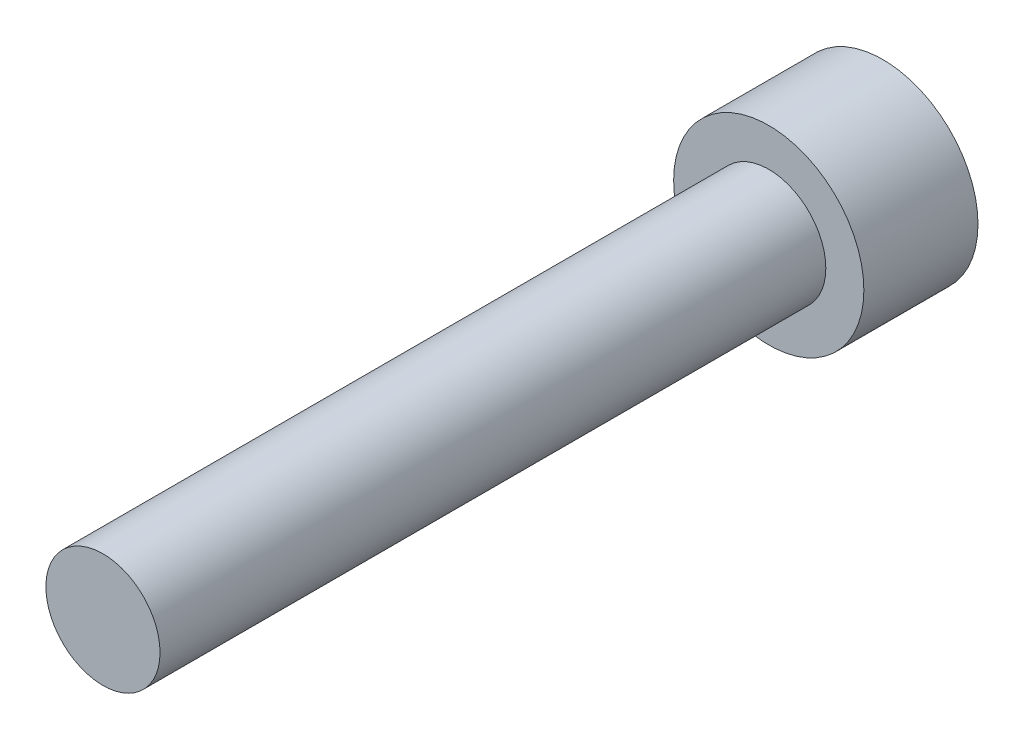
ISO-10303-21;
HEADER;
FILE_DESCRIPTION(('STEP AP214'),'2;1');
FILE_NAME('part.step','',(''),(''),'','','');
FILE_SCHEMA(('AUTOMOTIVE_DESIGN { 1 0 10303 214 1 1 1 1 }'));
ENDSEC;
DATA;
#1=APPLICATION_CONTEXT('core data for automotive mechanical design processes');
#2=APPLICATION_PROTOCOL_DEFINITION('international standard','automotive_design',2000,#1);
#3=PRODUCT_CONTEXT('',#1,'mechanical');
#4=PRODUCT('Part','Part','',(#3));
#5=PRODUCT_RELATED_PRODUCT_CATEGORY('part','',(#4));
#6=PRODUCT_DEFINITION_FORMATION('','',#4);
#7=PRODUCT_DEFINITION_CONTEXT('part definition',#1,'design');
#8=PRODUCT_DEFINITION('design','',#6,#7);
#9=PRODUCT_DEFINITION_SHAPE('','',#8);
#10=(LENGTH_UNIT() NAMED_UNIT(*) SI_UNIT(.MILLI.,.METRE.));
#11=(NAMED_UNIT(*) PLANE_ANGLE_UNIT() SI_UNIT($,.RADIAN.));
#12=(NAMED_UNIT(*) SI_UNIT($,.STERADIAN.) SOLID_ANGLE_UNIT());
#13=UNCERTAINTY_MEASURE_WITH_UNIT(LENGTH_MEASURE(1.E-05),#10,'distance_accuracy_value','');
#14=(GEOMETRIC_REPRESENTATION_CONTEXT(3) GLOBAL_UNCERTAINTY_ASSIGNED_CONTEXT((#13)) GLOBAL_UNIT_ASSIGNED_CONTEXT((#10,
#11,#12)) REPRESENTATION_CONTEXT('',''));
#15=CARTESIAN_POINT('',(0.,0.,0.));
#16=DIRECTION('',(0.,0.,1.));
#17=DIRECTION('',(1.,0.,0.));
#18=AXIS2_PLACEMENT_3D('',#15,#16,#17);
#19=CARTESIAN_POINT('',(0.,0.,0.));
#20=DIRECTION('',(0.,0.,-1.));
#21=DIRECTION('',(-1.,0.,0.));
#22=AXIS2_PLACEMENT_3D('',#19,#20,#21);
#23=CYLINDRICAL_SURFACE('',#22,5.);
#24=CARTESIAN_POINT('',(0.,0.,0.));
#25=DIRECTION('',(0.,0.,1.));
#26=DIRECTION('',(1.,0.,0.));
#27=AXIS2_PLACEMENT_3D('',#24,#25,#26);
#28=CIRCLE('',#27,5.);
#29=CARTESIAN_POINT('',(5.,0.,0.));
#30=VERTEX_POINT('',#29);
#31=EDGE_CURVE('E42',#30,#30,#28,.T.);
#32=ORIENTED_EDGE('',*,*,#31,.F.);
#33=EDGE_LOOP('',(#32));
#34=FACE_BOUND('',#33,.T.);
#35=CARTESIAN_POINT('',(0.,0.,-6.));
#36=DIRECTION('',(0.,0.,1.));
#37=DIRECTION('',(1.,0.,0.));
#38=AXIS2_PLACEMENT_3D('',#35,#36,#37);
#39=CIRCLE('',#38,5.);
#40=CARTESIAN_POINT('',(5.,0.,-6.));
#41=VERTEX_POINT('',#40);
#42=EDGE_CURVE('E37',#41,#41,#39,.T.);
#43=ORIENTED_EDGE('',*,*,#42,.T.);
#44=EDGE_LOOP('',(#43));
#45=FACE_BOUND('',#44,.T.);
#46=ADVANCED_FACE('F40',(#34,#45),#23,.T.);
#47=CARTESIAN_POINT('',(0.,0.,0.));
#48=DIRECTION('',(0.,0.,1.));
#49=DIRECTION('',(1.,0.,0.));
#50=AXIS2_PLACEMENT_3D('',#47,#48,#49);
#51=PLANE('',#50);
#52=CARTESIAN_POINT('',(0.,0.,0.));
#53=DIRECTION('',(0.,0.,1.));
#54=DIRECTION('',(1.,0.,0.));
#55=AXIS2_PLACEMENT_3D('',#52,#53,#54);
#56=CIRCLE('',#55,3.);
#57=CARTESIAN_POINT('',(3.,0.,0.));
#58=VERTEX_POINT('',#57);
#59=EDGE_CURVE('E10',#58,#58,#56,.T.);
#60=ORIENTED_EDGE('',*,*,#59,.F.);
#61=EDGE_LOOP('',(#60));
#62=FACE_BOUND('',#61,.T.);
#63=ORIENTED_EDGE('',*,*,#31,.T.);
#64=EDGE_LOOP('',(#63));
#65=FACE_BOUND('',#64,.T.);
#66=ADVANCED_FACE('F63',(#62,#65),#51,.T.);
#67=CARTESIAN_POINT('',(0.,0.,-6.));
#68=DIRECTION('',(0.,0.,1.));
#69=DIRECTION('',(1.,0.,0.));
#70=AXIS2_PLACEMENT_3D('',#67,#68,#69);
#71=PLANE('',#70);
#72=ORIENTED_EDGE('',*,*,#42,.F.);
#73=EDGE_LOOP('',(#72));
#74=FACE_BOUND('',#73,.T.);
#75=ADVANCED_FACE('F59',(#74),#71,.F.);
#76=CARTESIAN_POINT('',(0.,0.,35.));
#77=DIRECTION('',(0.,0.,-1.));
#78=DIRECTION('',(-1.,0.,0.));
#79=AXIS2_PLACEMENT_3D('',#76,#77,#78);
#80=CYLINDRICAL_SURFACE('',#79,3.);
#81=CARTESIAN_POINT('',(0.,0.,35.));
#82=DIRECTION('',(0.,0.,1.));
#83=DIRECTION('',(1.,0.,0.));
#84=AXIS2_PLACEMENT_3D('',#81,#82,#83);
#85=CIRCLE('',#84,3.);
#86=CARTESIAN_POINT('',(3.,0.,35.));
#87=VERTEX_POINT('',#86);
#88=EDGE_CURVE('E49',#87,#87,#85,.T.);
#89=ORIENTED_EDGE('',*,*,#88,.F.);
#90=EDGE_LOOP('',(#89));
#91=FACE_BOUND('',#90,.T.);
#92=ORIENTED_EDGE('',*,*,#59,.T.);
#93=EDGE_LOOP('',(#92));
#94=FACE_BOUND('',#93,.T.);
#95=ADVANCED_FACE('F58',(#91,#94),#80,.T.);
#96=CARTESIAN_POINT('',(0.,0.,35.));
#97=DIRECTION('',(0.,0.,1.));
#98=DIRECTION('',(1.,0.,0.));
#99=AXIS2_PLACEMENT_3D('',#96,#97,#98);
#100=PLANE('',#99);
#101=ORIENTED_EDGE('',*,*,#88,.T.);
#102=EDGE_LOOP('',(#101));
#103=FACE_BOUND('',#102,.T.);
#104=ADVANCED_FACE('F70',(#103),#100,.T.);
#105=CLOSED_SHELL('',(#46,#66,#75,#95,#104));
#106=MANIFOLD_SOLID_BREP('B2',#105);
#107=ADVANCED_BREP_SHAPE_REPRESENTATION('',(#18,#106),#14);
#108=SHAPE_DEFINITION_REPRESENTATION(#9,#107);
ENDSEC;
END-ISO-10303-21;
